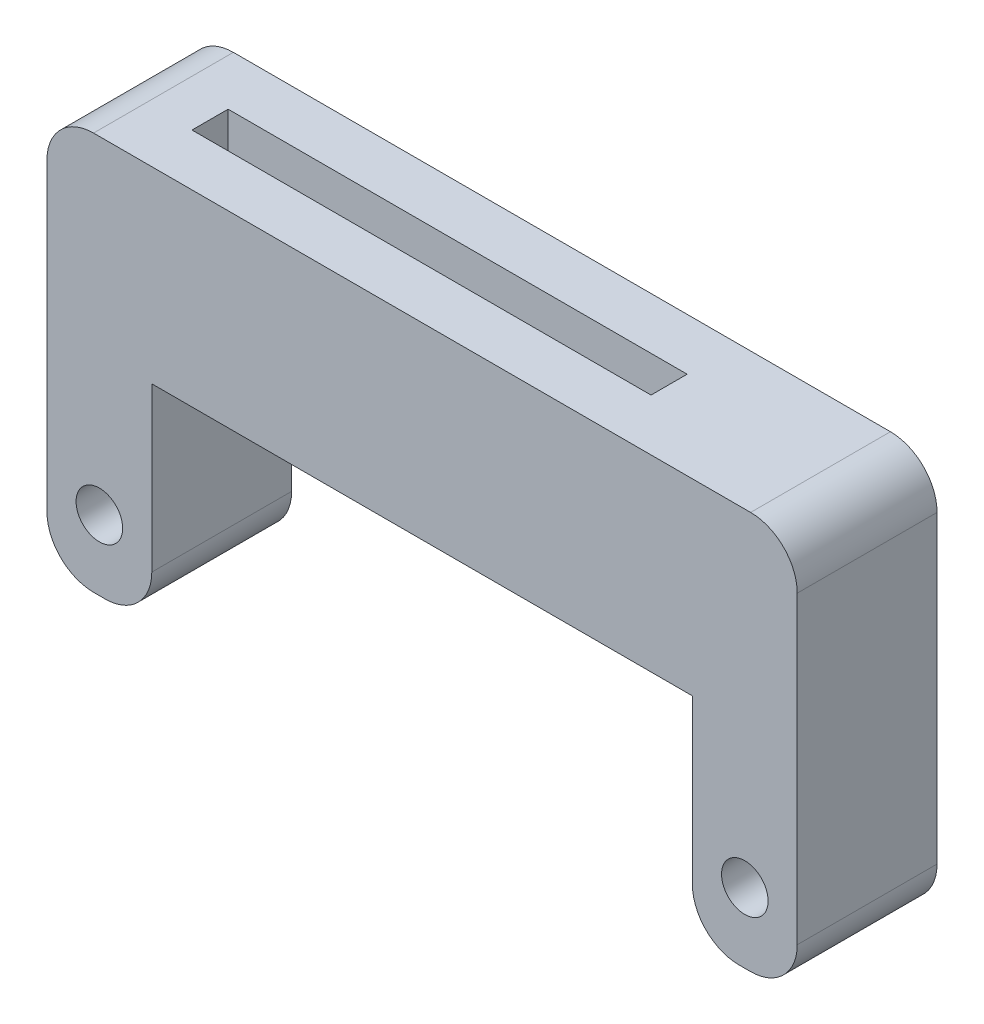
ISO-10303-21;
HEADER;
FILE_DESCRIPTION(('STEP AP214'),'2;1');
FILE_NAME('part.step','',(''),(''),'','','');
FILE_SCHEMA(('AUTOMOTIVE_DESIGN { 1 0 10303 214 1 1 1 1 }'));
ENDSEC;
DATA;
#1=APPLICATION_CONTEXT('core data for automotive mechanical design processes');
#2=APPLICATION_PROTOCOL_DEFINITION('international standard','automotive_design',2000,#1);
#3=PRODUCT_CONTEXT('',#1,'mechanical');
#4=PRODUCT('Part','Part','',(#3));
#5=PRODUCT_RELATED_PRODUCT_CATEGORY('part','',(#4));
#6=PRODUCT_DEFINITION_FORMATION('','',#4);
#7=PRODUCT_DEFINITION_CONTEXT('part definition',#1,'design');
#8=PRODUCT_DEFINITION('design','',#6,#7);
#9=PRODUCT_DEFINITION_SHAPE('','',#8);
#10=(LENGTH_UNIT() NAMED_UNIT(*) SI_UNIT(.MILLI.,.METRE.));
#11=(NAMED_UNIT(*) PLANE_ANGLE_UNIT() SI_UNIT($,.RADIAN.));
#12=(NAMED_UNIT(*) SI_UNIT($,.STERADIAN.) SOLID_ANGLE_UNIT());
#13=UNCERTAINTY_MEASURE_WITH_UNIT(LENGTH_MEASURE(1.E-05),#10,'distance_accuracy_value','');
#14=(GEOMETRIC_REPRESENTATION_CONTEXT(3) GLOBAL_UNCERTAINTY_ASSIGNED_CONTEXT((#13)) GLOBAL_UNIT_ASSIGNED_CONTEXT((#10,
#11,#12)) REPRESENTATION_CONTEXT('',''));
#15=CARTESIAN_POINT('',(0.,0.,0.));
#16=DIRECTION('',(0.,0.,1.));
#17=DIRECTION('',(1.,0.,0.));
#18=AXIS2_PLACEMENT_3D('',#15,#16,#17);
#19=CARTESIAN_POINT('',(-16.1,-8.534,3.));
#20=DIRECTION('',(0.,1.,0.));
#21=DIRECTION('',(0.,0.,1.));
#22=AXIS2_PLACEMENT_3D('',#19,#20,#21);
#23=PLANE('',#22);
#24=DIRECTION('',(1.,0.,0.));
#25=VECTOR('',#24,1.);
#26=CARTESIAN_POINT('',(-16.1,-8.534,3.));
#27=LINE('',#26,#25);
#28=CARTESIAN_POINT('',(-14.1,-8.534,3.));
#29=VERTEX_POINT('',#28);
#30=CARTESIAN_POINT('',(-13.6,-8.534,3.));
#31=VERTEX_POINT('',#30);
#32=EDGE_CURVE('E272',#29,#31,#27,.T.);
#33=ORIENTED_EDGE('',*,*,#32,.F.);
#34=DIRECTION('',(0.,0.,-1.));
#35=VECTOR('',#34,1.);
#36=CARTESIAN_POINT('',(-14.1,-8.534,3.));
#37=LINE('',#36,#35);
#38=CARTESIAN_POINT('',(-14.1,-8.534,-3.));
#39=VERTEX_POINT('',#38);
#40=EDGE_CURVE('E291',#29,#39,#37,.T.);
#41=ORIENTED_EDGE('',*,*,#40,.T.);
#42=DIRECTION('',(1.,0.,0.));
#43=VECTOR('',#42,1.);
#44=CARTESIAN_POINT('',(-16.1,-8.534,-3.));
#45=LINE('',#44,#43);
#46=CARTESIAN_POINT('',(-13.6,-8.534,-3.));
#47=VERTEX_POINT('',#46);
#48=EDGE_CURVE('E261',#39,#47,#45,.T.);
#49=ORIENTED_EDGE('',*,*,#48,.T.);
#50=DIRECTION('',(0.,0.,1.));
#51=VECTOR('',#50,1.);
#52=CARTESIAN_POINT('',(-13.6,-8.534,3.));
#53=LINE('',#52,#51);
#54=EDGE_CURVE('E287',#47,#31,#53,.T.);
#55=ORIENTED_EDGE('',*,*,#54,.T.);
#56=EDGE_LOOP('',(#33,#41,#49,#55));
#57=FACE_BOUND('',#56,.T.);
#58=ADVANCED_FACE('F41',(#57),#23,.F.);
#59=CARTESIAN_POINT('',(16.1,-8.534,3.));
#60=DIRECTION('',(-1.,0.,0.));
#61=DIRECTION('',(0.,0.,1.));
#62=AXIS2_PLACEMENT_3D('',#59,#60,#61);
#63=PLANE('',#62);
#64=DIRECTION('',(0.,1.,0.));
#65=VECTOR('',#64,1.);
#66=CARTESIAN_POINT('',(16.1,-8.534,3.));
#67=LINE('',#66,#65);
#68=CARTESIAN_POINT('',(16.1,-6.534,3.));
#69=VERTEX_POINT('',#68);
#70=CARTESIAN_POINT('',(16.1,6.534,3.));
#71=VERTEX_POINT('',#70);
#72=EDGE_CURVE('E257',#69,#71,#67,.T.);
#73=ORIENTED_EDGE('',*,*,#72,.F.);
#74=DIRECTION('',(0.,0.,-1.));
#75=VECTOR('',#74,1.);
#76=CARTESIAN_POINT('',(16.1,-6.534,3.));
#77=LINE('',#76,#75);
#78=CARTESIAN_POINT('',(16.1,-6.534,-3.));
#79=VERTEX_POINT('',#78);
#80=EDGE_CURVE('E352',#69,#79,#77,.T.);
#81=ORIENTED_EDGE('',*,*,#80,.T.);
#82=DIRECTION('',(0.,1.,0.));
#83=VECTOR('',#82,1.);
#84=CARTESIAN_POINT('',(16.1,-8.534,-3.));
#85=LINE('',#84,#83);
#86=CARTESIAN_POINT('',(16.1,6.534,-3.));
#87=VERTEX_POINT('',#86);
#88=EDGE_CURVE('E247',#79,#87,#85,.T.);
#89=ORIENTED_EDGE('',*,*,#88,.T.);
#90=DIRECTION('',(0.,0.,-1.));
#91=VECTOR('',#90,1.);
#92=CARTESIAN_POINT('',(16.1,6.534,3.));
#93=LINE('',#92,#91);
#94=EDGE_CURVE('E349',#87,#71,#93,.F.);
#95=ORIENTED_EDGE('',*,*,#94,.T.);
#96=EDGE_LOOP('',(#73,#81,#89,#95));
#97=FACE_BOUND('',#96,.T.);
#98=ADVANCED_FACE('F387',(#97),#63,.F.);
#99=CARTESIAN_POINT('',(-16.1,8.534,3.));
#100=DIRECTION('',(0.,-1.,0.));
#101=DIRECTION('',(0.,0.,-1.));
#102=AXIS2_PLACEMENT_3D('',#99,#100,#101);
#103=PLANE('',#102);
#104=DIRECTION('',(1.,0.,0.));
#105=VECTOR('',#104,1.);
#106=CARTESIAN_POINT('',(-12.1,8.534,0.775));
#107=LINE('',#106,#105);
#108=CARTESIAN_POINT('',(-12.1,8.534,0.775));
#109=VERTEX_POINT('',#108);
#110=CARTESIAN_POINT('',(7.6,8.534,0.775));
#111=VERTEX_POINT('',#110);
#112=EDGE_CURVE('E233',#109,#111,#107,.T.);
#113=ORIENTED_EDGE('',*,*,#112,.F.);
#114=DIRECTION('',(0.,0.,1.));
#115=VECTOR('',#114,1.);
#116=CARTESIAN_POINT('',(-12.1,8.534,-0.775));
#117=LINE('',#116,#115);
#118=CARTESIAN_POINT('',(-12.1,8.534,-0.775));
#119=VERTEX_POINT('',#118);
#120=EDGE_CURVE('E181',#119,#109,#117,.T.);
#121=ORIENTED_EDGE('',*,*,#120,.F.);
#122=DIRECTION('',(-1.,0.,0.));
#123=VECTOR('',#122,1.);
#124=CARTESIAN_POINT('',(-12.1,8.534,-0.775));
#125=LINE('',#124,#123);
#126=CARTESIAN_POINT('',(7.6,8.534,-0.775));
#127=VERTEX_POINT('',#126);
#128=EDGE_CURVE('E218',#127,#119,#125,.T.);
#129=ORIENTED_EDGE('',*,*,#128,.F.);
#130=DIRECTION('',(0.,0.,-1.));
#131=VECTOR('',#130,1.);
#132=CARTESIAN_POINT('',(7.6,8.534,-0.775));
#133=LINE('',#132,#131);
#134=EDGE_CURVE('E237',#111,#127,#133,.T.);
#135=ORIENTED_EDGE('',*,*,#134,.F.);
#136=EDGE_LOOP('',(#113,#121,#129,#135));
#137=FACE_BOUND('',#136,.T.);
#138=DIRECTION('',(-1.,0.,0.));
#139=VECTOR('',#138,1.);
#140=CARTESIAN_POINT('',(-16.1,8.534,3.));
#141=LINE('',#140,#139);
#142=CARTESIAN_POINT('',(14.1,8.534,3.));
#143=VERTEX_POINT('',#142);
#144=CARTESIAN_POINT('',(-14.1,8.534,3.));
#145=VERTEX_POINT('',#144);
#146=EDGE_CURVE('E260',#143,#145,#141,.T.);
#147=ORIENTED_EDGE('',*,*,#146,.F.);
#148=DIRECTION('',(0.,0.,-1.));
#149=VECTOR('',#148,1.);
#150=CARTESIAN_POINT('',(14.1,8.534,3.));
#151=LINE('',#150,#149);
#152=CARTESIAN_POINT('',(14.1,8.534,-3.));
#153=VERTEX_POINT('',#152);
#154=EDGE_CURVE('E11',#143,#153,#151,.T.);
#155=ORIENTED_EDGE('',*,*,#154,.T.);
#156=DIRECTION('',(-1.,0.,0.));
#157=VECTOR('',#156,1.);
#158=CARTESIAN_POINT('',(-16.1,8.534,-3.));
#159=LINE('',#158,#157);
#160=CARTESIAN_POINT('',(-14.1,8.534,-3.));
#161=VERTEX_POINT('',#160);
#162=EDGE_CURVE('E276',#153,#161,#159,.T.);
#163=ORIENTED_EDGE('',*,*,#162,.T.);
#164=DIRECTION('',(0.,0.,-1.));
#165=VECTOR('',#164,1.);
#166=CARTESIAN_POINT('',(-14.1,8.534,3.));
#167=LINE('',#166,#165);
#168=EDGE_CURVE('E50',#161,#145,#167,.F.);
#169=ORIENTED_EDGE('',*,*,#168,.T.);
#170=EDGE_LOOP('',(#147,#155,#163,#169));
#171=FACE_BOUND('',#170,.T.);
#172=ADVANCED_FACE('F379',(#137,#171),#103,.F.);
#173=CARTESIAN_POINT('',(-16.1,-8.534,3.));
#174=DIRECTION('',(1.,0.,0.));
#175=DIRECTION('',(0.,0.,-1.));
#176=AXIS2_PLACEMENT_3D('',#173,#174,#175);
#177=PLANE('',#176);
#178=DIRECTION('',(0.,-1.,0.));
#179=VECTOR('',#178,1.);
#180=CARTESIAN_POINT('',(-16.1,-8.534,-3.));
#181=LINE('',#180,#179);
#182=CARTESIAN_POINT('',(-16.1,6.534,-3.));
#183=VERTEX_POINT('',#182);
#184=CARTESIAN_POINT('',(-16.1,-6.534,-3.));
#185=VERTEX_POINT('',#184);
#186=EDGE_CURVE('E279',#183,#185,#181,.T.);
#187=ORIENTED_EDGE('',*,*,#186,.T.);
#188=DIRECTION('',(0.,0.,-1.));
#189=VECTOR('',#188,1.);
#190=CARTESIAN_POINT('',(-16.1,-6.534,3.));
#191=LINE('',#190,#189);
#192=CARTESIAN_POINT('',(-16.1,-6.534,3.));
#193=VERTEX_POINT('',#192);
#194=EDGE_CURVE('E317',#185,#193,#191,.F.);
#195=ORIENTED_EDGE('',*,*,#194,.T.);
#196=DIRECTION('',(0.,-1.,0.));
#197=VECTOR('',#196,1.);
#198=CARTESIAN_POINT('',(-16.1,-8.534,3.));
#199=LINE('',#198,#197);
#200=CARTESIAN_POINT('',(-16.1,6.534,3.));
#201=VERTEX_POINT('',#200);
#202=EDGE_CURVE('E264',#201,#193,#199,.T.);
#203=ORIENTED_EDGE('',*,*,#202,.F.);
#204=DIRECTION('',(0.,0.,-1.));
#205=VECTOR('',#204,1.);
#206=CARTESIAN_POINT('',(-16.1,6.534,3.));
#207=LINE('',#206,#205);
#208=EDGE_CURVE('E313',#201,#183,#207,.T.);
#209=ORIENTED_EDGE('',*,*,#208,.T.);
#210=EDGE_LOOP('',(#187,#195,#203,#209));
#211=FACE_BOUND('',#210,.T.);
#212=ADVANCED_FACE('F373',(#211),#177,.F.);
#213=CARTESIAN_POINT('',(13.6,-8.534,3.));
#214=VERTEX_POINT('',#213);
#215=CARTESIAN_POINT('',(14.1,-8.534,3.));
#216=VERTEX_POINT('',#215);
#217=EDGE_CURVE('E268',#214,#216,#27,.T.);
#218=ORIENTED_EDGE('',*,*,#217,.F.);
#219=DIRECTION('',(0.,0.,1.));
#220=VECTOR('',#219,1.);
#221=CARTESIAN_POINT('',(13.6,-8.534,3.));
#222=LINE('',#221,#220);
#223=CARTESIAN_POINT('',(13.6,-8.534,-3.));
#224=VERTEX_POINT('',#223);
#225=EDGE_CURVE('E346',#214,#224,#222,.F.);
#226=ORIENTED_EDGE('',*,*,#225,.T.);
#227=CARTESIAN_POINT('',(14.1,-8.534,-3.));
#228=VERTEX_POINT('',#227);
#229=EDGE_CURVE('E283',#224,#228,#45,.T.);
#230=ORIENTED_EDGE('',*,*,#229,.T.);
#231=DIRECTION('',(0.,0.,-1.));
#232=VECTOR('',#231,1.);
#233=CARTESIAN_POINT('',(14.1,-8.534,3.));
#234=LINE('',#233,#232);
#235=EDGE_CURVE('E343',#228,#216,#234,.F.);
#236=ORIENTED_EDGE('',*,*,#235,.T.);
#237=EDGE_LOOP('',(#218,#226,#230,#236));
#238=FACE_BOUND('',#237,.T.);
#239=ADVANCED_FACE('F397',(#238),#23,.F.);
#240=CARTESIAN_POINT('',(0.,0.,3.));
#241=DIRECTION('',(0.,0.,-1.));
#242=DIRECTION('',(-1.,0.,0.));
#243=AXIS2_PLACEMENT_3D('',#240,#241,#242);
#244=PLANE('',#243);
#245=CARTESIAN_POINT('',(-13.85,-5.534,3.));
#246=DIRECTION('',(0.,0.,1.));
#247=DIRECTION('',(1.,0.,0.));
#248=AXIS2_PLACEMENT_3D('',#245,#246,#247);
#249=CIRCLE('',#248,1.);
#250=CARTESIAN_POINT('',(-12.85,-5.534,3.));
#251=VERTEX_POINT('',#250);
#252=EDGE_CURVE('E618',#251,#251,#249,.T.);
#253=ORIENTED_EDGE('',*,*,#252,.F.);
#254=EDGE_LOOP('',(#253));
#255=FACE_BOUND('',#254,.T.);
#256=CARTESIAN_POINT('',(13.85,-5.534,3.));
#257=DIRECTION('',(0.,0.,1.));
#258=DIRECTION('',(1.,0.,0.));
#259=AXIS2_PLACEMENT_3D('',#256,#257,#258);
#260=CIRCLE('',#259,1.);
#261=CARTESIAN_POINT('',(14.85,-5.534,3.));
#262=VERTEX_POINT('',#261);
#263=EDGE_CURVE('E626',#262,#262,#260,.T.);
#264=ORIENTED_EDGE('',*,*,#263,.F.);
#265=EDGE_LOOP('',(#264));
#266=FACE_BOUND('',#265,.T.);
#267=ORIENTED_EDGE('',*,*,#202,.T.);
#268=CARTESIAN_POINT('',(-14.1,-6.534,3.));
#269=DIRECTION('',(0.,0.,-1.));
#270=DIRECTION('',(-1.,0.,0.));
#271=AXIS2_PLACEMENT_3D('',#268,#269,#270);
#272=CIRCLE('',#271,2.);
#273=EDGE_CURVE('E334',#193,#29,#272,.F.);
#274=ORIENTED_EDGE('',*,*,#273,.T.);
#275=ORIENTED_EDGE('',*,*,#32,.T.);
#276=CARTESIAN_POINT('',(-13.6,-6.534,3.));
#277=DIRECTION('',(0.,0.,-1.));
#278=DIRECTION('',(-1.,0.,0.));
#279=AXIS2_PLACEMENT_3D('',#276,#277,#278);
#280=CIRCLE('',#279,2.);
#281=CARTESIAN_POINT('',(-11.6,-6.534,3.));
#282=VERTEX_POINT('',#281);
#283=EDGE_CURVE('E331',#31,#282,#280,.F.);
#284=ORIENTED_EDGE('',*,*,#283,.T.);
#285=DIRECTION('',(0.,-1.,0.));
#286=VECTOR('',#285,1.);
#287=CARTESIAN_POINT('',(-11.6,-8.534,3.));
#288=LINE('',#287,#286);
#289=CARTESIAN_POINT('',(-11.6,0.465999999999999,3.));
#290=VERTEX_POINT('',#289);
#291=EDGE_CURVE('E204',#290,#282,#288,.T.);
#292=ORIENTED_EDGE('',*,*,#291,.F.);
#293=DIRECTION('',(-1.,0.,0.));
#294=VECTOR('',#293,1.);
#295=CARTESIAN_POINT('',(-11.6,0.465999999999999,3.));
#296=LINE('',#295,#294);
#297=CARTESIAN_POINT('',(11.6,0.465999999999999,3.));
#298=VERTEX_POINT('',#297);
#299=EDGE_CURVE('E176',#298,#290,#296,.T.);
#300=ORIENTED_EDGE('',*,*,#299,.F.);
#301=DIRECTION('',(0.,1.,0.));
#302=VECTOR('',#301,1.);
#303=CARTESIAN_POINT('',(11.6,-8.534,3.));
#304=LINE('',#303,#302);
#305=CARTESIAN_POINT('',(11.6,-6.534,3.));
#306=VERTEX_POINT('',#305);
#307=EDGE_CURVE('E207',#306,#298,#304,.T.);
#308=ORIENTED_EDGE('',*,*,#307,.F.);
#309=CARTESIAN_POINT('',(13.6,-6.534,3.));
#310=DIRECTION('',(0.,0.,-1.));
#311=DIRECTION('',(-1.,0.,0.));
#312=AXIS2_PLACEMENT_3D('',#309,#310,#311);
#313=CIRCLE('',#312,2.);
#314=EDGE_CURVE('E328',#306,#214,#313,.F.);
#315=ORIENTED_EDGE('',*,*,#314,.T.);
#316=ORIENTED_EDGE('',*,*,#217,.T.);
#317=CARTESIAN_POINT('',(14.1,-6.534,3.));
#318=DIRECTION('',(0.,0.,-1.));
#319=DIRECTION('',(-1.,0.,0.));
#320=AXIS2_PLACEMENT_3D('',#317,#318,#319);
#321=CIRCLE('',#320,2.);
#322=EDGE_CURVE('E325',#216,#69,#321,.F.);
#323=ORIENTED_EDGE('',*,*,#322,.T.);
#324=ORIENTED_EDGE('',*,*,#72,.T.);
#325=CARTESIAN_POINT('',(14.1,6.534,3.));
#326=DIRECTION('',(0.,0.,-1.));
#327=DIRECTION('',(-1.,0.,0.));
#328=AXIS2_PLACEMENT_3D('',#325,#326,#327);
#329=CIRCLE('',#328,2.);
#330=EDGE_CURVE('E63',#71,#143,#329,.F.);
#331=ORIENTED_EDGE('',*,*,#330,.T.);
#332=ORIENTED_EDGE('',*,*,#146,.T.);
#333=CARTESIAN_POINT('',(-14.1,6.534,3.));
#334=DIRECTION('',(0.,0.,-1.));
#335=DIRECTION('',(-1.,0.,0.));
#336=AXIS2_PLACEMENT_3D('',#333,#334,#335);
#337=CIRCLE('',#336,2.);
#338=EDGE_CURVE('E320',#145,#201,#337,.F.);
#339=ORIENTED_EDGE('',*,*,#338,.T.);
#340=EDGE_LOOP('',(#267,#274,#275,#284,#292,#300,#308,#315,#316,#323,#324,#331,#332,#339));
#341=FACE_BOUND('',#340,.T.);
#342=ADVANCED_FACE('F366',(#255,#266,#341),#244,.F.);
#343=CARTESIAN_POINT('',(0.,0.,-3.));
#344=DIRECTION('',(0.,0.,-1.));
#345=DIRECTION('',(-1.,0.,0.));
#346=AXIS2_PLACEMENT_3D('',#343,#344,#345);
#347=PLANE('',#346);
#348=CARTESIAN_POINT('',(-13.85,-5.534,-3.));
#349=DIRECTION('',(0.,0.,1.));
#350=DIRECTION('',(1.,0.,0.));
#351=AXIS2_PLACEMENT_3D('',#348,#349,#350);
#352=CIRCLE('',#351,1.);
#353=CARTESIAN_POINT('',(-12.85,-5.534,-3.));
#354=VERTEX_POINT('',#353);
#355=EDGE_CURVE('E208',#354,#354,#352,.T.);
#356=ORIENTED_EDGE('',*,*,#355,.T.);
#357=EDGE_LOOP('',(#356));
#358=FACE_BOUND('',#357,.T.);
#359=CARTESIAN_POINT('',(13.85,-5.534,-3.));
#360=DIRECTION('',(0.,0.,1.));
#361=DIRECTION('',(1.,0.,0.));
#362=AXIS2_PLACEMENT_3D('',#359,#360,#361);
#363=CIRCLE('',#362,1.);
#364=CARTESIAN_POINT('',(14.85,-5.534,-3.));
#365=VERTEX_POINT('',#364);
#366=EDGE_CURVE('E620',#365,#365,#363,.T.);
#367=ORIENTED_EDGE('',*,*,#366,.T.);
#368=EDGE_LOOP('',(#367));
#369=FACE_BOUND('',#368,.T.);
#370=ORIENTED_EDGE('',*,*,#48,.F.);
#371=CARTESIAN_POINT('',(-14.1,-6.534,-3.));
#372=DIRECTION('',(0.,0.,-1.));
#373=DIRECTION('',(-1.,0.,0.));
#374=AXIS2_PLACEMENT_3D('',#371,#372,#373);
#375=CIRCLE('',#374,2.);
#376=EDGE_CURVE('E310',#39,#185,#375,.T.);
#377=ORIENTED_EDGE('',*,*,#376,.T.);
#378=ORIENTED_EDGE('',*,*,#186,.F.);
#379=CARTESIAN_POINT('',(-14.1,6.534,-3.));
#380=DIRECTION('',(0.,0.,-1.));
#381=DIRECTION('',(-1.,0.,0.));
#382=AXIS2_PLACEMENT_3D('',#379,#380,#381);
#383=CIRCLE('',#382,2.);
#384=EDGE_CURVE('E295',#183,#161,#383,.T.);
#385=ORIENTED_EDGE('',*,*,#384,.T.);
#386=ORIENTED_EDGE('',*,*,#162,.F.);
#387=CARTESIAN_POINT('',(14.1,6.534,-3.));
#388=DIRECTION('',(0.,0.,-1.));
#389=DIRECTION('',(-1.,0.,0.));
#390=AXIS2_PLACEMENT_3D('',#387,#388,#389);
#391=CIRCLE('',#390,2.);
#392=EDGE_CURVE('E298',#153,#87,#391,.T.);
#393=ORIENTED_EDGE('',*,*,#392,.T.);
#394=ORIENTED_EDGE('',*,*,#88,.F.);
#395=CARTESIAN_POINT('',(14.1,-6.534,-3.));
#396=DIRECTION('',(0.,0.,-1.));
#397=DIRECTION('',(-1.,0.,0.));
#398=AXIS2_PLACEMENT_3D('',#395,#396,#397);
#399=CIRCLE('',#398,2.);
#400=EDGE_CURVE('E301',#79,#228,#399,.T.);
#401=ORIENTED_EDGE('',*,*,#400,.T.);
#402=ORIENTED_EDGE('',*,*,#229,.F.);
#403=CARTESIAN_POINT('',(13.6,-6.534,-3.));
#404=DIRECTION('',(0.,0.,-1.));
#405=DIRECTION('',(-1.,0.,0.));
#406=AXIS2_PLACEMENT_3D('',#403,#404,#405);
#407=CIRCLE('',#406,2.);
#408=CARTESIAN_POINT('',(11.6,-6.534,-3.));
#409=VERTEX_POINT('',#408);
#410=EDGE_CURVE('E304',#224,#409,#407,.T.);
#411=ORIENTED_EDGE('',*,*,#410,.T.);
#412=DIRECTION('',(0.,1.,0.));
#413=VECTOR('',#412,1.);
#414=CARTESIAN_POINT('',(11.6,-8.534,-3.));
#415=LINE('',#414,#413);
#416=CARTESIAN_POINT('',(11.6,0.465999999999999,-3.));
#417=VERTEX_POINT('',#416);
#418=EDGE_CURVE('E192',#409,#417,#415,.T.);
#419=ORIENTED_EDGE('',*,*,#418,.T.);
#420=DIRECTION('',(-1.,0.,0.));
#421=VECTOR('',#420,1.);
#422=CARTESIAN_POINT('',(-11.6,0.465999999999999,-3.));
#423=LINE('',#422,#421);
#424=CARTESIAN_POINT('',(-11.6,0.465999999999999,-3.));
#425=VERTEX_POINT('',#424);
#426=EDGE_CURVE('E173',#417,#425,#423,.T.);
#427=ORIENTED_EDGE('',*,*,#426,.T.);
#428=DIRECTION('',(0.,-1.,0.));
#429=VECTOR('',#428,1.);
#430=CARTESIAN_POINT('',(-11.6,-8.534,-3.));
#431=LINE('',#430,#429);
#432=CARTESIAN_POINT('',(-11.6,-6.534,-3.));
#433=VERTEX_POINT('',#432);
#434=EDGE_CURVE('E185',#425,#433,#431,.T.);
#435=ORIENTED_EDGE('',*,*,#434,.T.);
#436=CARTESIAN_POINT('',(-13.6,-6.534,-3.));
#437=DIRECTION('',(0.,0.,-1.));
#438=DIRECTION('',(-1.,0.,0.));
#439=AXIS2_PLACEMENT_3D('',#436,#437,#438);
#440=CIRCLE('',#439,2.);
#441=EDGE_CURVE('E307',#433,#47,#440,.T.);
#442=ORIENTED_EDGE('',*,*,#441,.T.);
#443=EDGE_LOOP('',(#370,#377,#378,#385,#386,#393,#394,#401,#402,#411,#419,#427,#435,#442));
#444=FACE_BOUND('',#443,.T.);
#445=ADVANCED_FACE('F195',(#358,#369,#444),#347,.T.);
#446=CARTESIAN_POINT('',(-12.1,3.534,-0.775));
#447=DIRECTION('',(-1.,0.,0.));
#448=DIRECTION('',(0.,0.,1.));
#449=AXIS2_PLACEMENT_3D('',#446,#447,#448);
#450=PLANE('',#449);
#451=ORIENTED_EDGE('',*,*,#120,.T.);
#452=DIRECTION('',(0.,1.,0.));
#453=VECTOR('',#452,1.);
#454=CARTESIAN_POINT('',(-12.1,3.534,0.775));
#455=LINE('',#454,#453);
#456=CARTESIAN_POINT('',(-12.1,3.534,0.775));
#457=VERTEX_POINT('',#456);
#458=EDGE_CURVE('E230',#457,#109,#455,.T.);
#459=ORIENTED_EDGE('',*,*,#458,.F.);
#460=DIRECTION('',(0.,0.,1.));
#461=VECTOR('',#460,1.);
#462=CARTESIAN_POINT('',(-12.1,3.534,-0.775));
#463=LINE('',#462,#461);
#464=CARTESIAN_POINT('',(-12.1,3.534,-0.775));
#465=VERTEX_POINT('',#464);
#466=EDGE_CURVE('E213',#465,#457,#463,.T.);
#467=ORIENTED_EDGE('',*,*,#466,.F.);
#468=DIRECTION('',(0.,1.,0.));
#469=VECTOR('',#468,1.);
#470=CARTESIAN_POINT('',(-12.1,3.534,-0.775));
#471=LINE('',#470,#469);
#472=EDGE_CURVE('E244',#465,#119,#471,.T.);
#473=ORIENTED_EDGE('',*,*,#472,.T.);
#474=EDGE_LOOP('',(#451,#459,#467,#473));
#475=FACE_BOUND('',#474,.T.);
#476=ADVANCED_FACE('F506',(#475),#450,.F.);
#477=CARTESIAN_POINT('',(-12.1,3.534,-0.775));
#478=DIRECTION('',(0.,0.,-1.));
#479=DIRECTION('',(-1.,0.,0.));
#480=AXIS2_PLACEMENT_3D('',#477,#478,#479);
#481=PLANE('',#480);
#482=ORIENTED_EDGE('',*,*,#128,.T.);
#483=ORIENTED_EDGE('',*,*,#472,.F.);
#484=DIRECTION('',(-1.,0.,0.));
#485=VECTOR('',#484,1.);
#486=CARTESIAN_POINT('',(-12.1,3.534,-0.775));
#487=LINE('',#486,#485);
#488=CARTESIAN_POINT('',(7.6,3.534,-0.775));
#489=VERTEX_POINT('',#488);
#490=EDGE_CURVE('E226',#489,#465,#487,.T.);
#491=ORIENTED_EDGE('',*,*,#490,.F.);
#492=DIRECTION('',(0.,1.,0.));
#493=VECTOR('',#492,1.);
#494=CARTESIAN_POINT('',(7.6,3.534,-0.775));
#495=LINE('',#494,#493);
#496=EDGE_CURVE('E248',#489,#127,#495,.T.);
#497=ORIENTED_EDGE('',*,*,#496,.T.);
#498=EDGE_LOOP('',(#482,#483,#491,#497));
#499=FACE_BOUND('',#498,.T.);
#500=ADVANCED_FACE('F584',(#499),#481,.F.);
#501=CARTESIAN_POINT('',(7.6,3.534,-0.775));
#502=DIRECTION('',(1.,0.,0.));
#503=DIRECTION('',(0.,0.,-1.));
#504=AXIS2_PLACEMENT_3D('',#501,#502,#503);
#505=PLANE('',#504);
#506=ORIENTED_EDGE('',*,*,#134,.T.);
#507=ORIENTED_EDGE('',*,*,#496,.F.);
#508=DIRECTION('',(0.,0.,-1.));
#509=VECTOR('',#508,1.);
#510=CARTESIAN_POINT('',(7.6,3.534,-0.775));
#511=LINE('',#510,#509);
#512=CARTESIAN_POINT('',(7.6,3.534,0.775));
#513=VERTEX_POINT('',#512);
#514=EDGE_CURVE('E222',#513,#489,#511,.T.);
#515=ORIENTED_EDGE('',*,*,#514,.F.);
#516=DIRECTION('',(0.,1.,0.));
#517=VECTOR('',#516,1.);
#518=CARTESIAN_POINT('',(7.6,3.534,0.775));
#519=LINE('',#518,#517);
#520=EDGE_CURVE('E251',#513,#111,#519,.T.);
#521=ORIENTED_EDGE('',*,*,#520,.T.);
#522=EDGE_LOOP('',(#506,#507,#515,#521));
#523=FACE_BOUND('',#522,.T.);
#524=ADVANCED_FACE('F574',(#523),#505,.F.);
#525=CARTESIAN_POINT('',(-12.1,3.534,0.775));
#526=DIRECTION('',(0.,0.,1.));
#527=DIRECTION('',(1.,0.,0.));
#528=AXIS2_PLACEMENT_3D('',#525,#526,#527);
#529=PLANE('',#528);
#530=ORIENTED_EDGE('',*,*,#112,.T.);
#531=ORIENTED_EDGE('',*,*,#520,.F.);
#532=DIRECTION('',(1.,0.,0.));
#533=VECTOR('',#532,1.);
#534=CARTESIAN_POINT('',(-12.1,3.534,0.775));
#535=LINE('',#534,#533);
#536=EDGE_CURVE('E217',#457,#513,#535,.T.);
#537=ORIENTED_EDGE('',*,*,#536,.F.);
#538=ORIENTED_EDGE('',*,*,#458,.T.);
#539=EDGE_LOOP('',(#530,#531,#537,#538));
#540=FACE_BOUND('',#539,.T.);
#541=ADVANCED_FACE('F564',(#540),#529,.F.);
#542=CARTESIAN_POINT('',(0.,3.534,0.));
#543=DIRECTION('',(0.,1.,0.));
#544=DIRECTION('',(0.,0.,1.));
#545=AXIS2_PLACEMENT_3D('',#542,#543,#544);
#546=PLANE('',#545);
#547=ORIENTED_EDGE('',*,*,#466,.T.);
#548=ORIENTED_EDGE('',*,*,#536,.T.);
#549=ORIENTED_EDGE('',*,*,#514,.T.);
#550=ORIENTED_EDGE('',*,*,#490,.T.);
#551=EDGE_LOOP('',(#547,#548,#549,#550));
#552=FACE_BOUND('',#551,.T.);
#553=ADVANCED_FACE('F496',(#552),#546,.T.);
#554=CARTESIAN_POINT('',(-11.6,-8.534,-3.));
#555=DIRECTION('',(-1.,0.,0.));
#556=DIRECTION('',(0.,0.,1.));
#557=AXIS2_PLACEMENT_3D('',#554,#555,#556);
#558=PLANE('',#557);
#559=ORIENTED_EDGE('',*,*,#291,.T.);
#560=DIRECTION('',(0.,0.,1.));
#561=VECTOR('',#560,1.);
#562=CARTESIAN_POINT('',(-11.6,-6.534,-3.));
#563=LINE('',#562,#561);
#564=EDGE_CURVE('E188',#282,#433,#563,.F.);
#565=ORIENTED_EDGE('',*,*,#564,.T.);
#566=ORIENTED_EDGE('',*,*,#434,.F.);
#567=DIRECTION('',(0.,0.,1.));
#568=VECTOR('',#567,1.);
#569=CARTESIAN_POINT('',(-11.6,0.465999999999999,-3.));
#570=LINE('',#569,#568);
#571=EDGE_CURVE('E168',#425,#290,#570,.T.);
#572=ORIENTED_EDGE('',*,*,#571,.T.);
#573=EDGE_LOOP('',(#559,#565,#566,#572));
#574=FACE_BOUND('',#573,.T.);
#575=ADVANCED_FACE('F186',(#574),#558,.F.);
#576=CARTESIAN_POINT('',(-11.6,0.465999999999999,-3.));
#577=DIRECTION('',(0.,1.,0.));
#578=DIRECTION('',(0.,0.,1.));
#579=AXIS2_PLACEMENT_3D('',#576,#577,#578);
#580=PLANE('',#579);
#581=ORIENTED_EDGE('',*,*,#299,.T.);
#582=ORIENTED_EDGE('',*,*,#571,.F.);
#583=ORIENTED_EDGE('',*,*,#426,.F.);
#584=DIRECTION('',(0.,0.,1.));
#585=VECTOR('',#584,1.);
#586=CARTESIAN_POINT('',(11.6,0.465999999999999,-3.));
#587=LINE('',#586,#585);
#588=EDGE_CURVE('E182',#417,#298,#587,.T.);
#589=ORIENTED_EDGE('',*,*,#588,.T.);
#590=EDGE_LOOP('',(#581,#582,#583,#589));
#591=FACE_BOUND('',#590,.T.);
#592=ADVANCED_FACE('F170',(#591),#580,.F.);
#593=CARTESIAN_POINT('',(11.6,-8.534,-3.));
#594=DIRECTION('',(1.,0.,0.));
#595=DIRECTION('',(0.,0.,-1.));
#596=AXIS2_PLACEMENT_3D('',#593,#594,#595);
#597=PLANE('',#596);
#598=ORIENTED_EDGE('',*,*,#418,.F.);
#599=DIRECTION('',(0.,0.,1.));
#600=VECTOR('',#599,1.);
#601=CARTESIAN_POINT('',(11.6,-6.534,-3.));
#602=LINE('',#601,#600);
#603=EDGE_CURVE('E339',#409,#306,#602,.T.);
#604=ORIENTED_EDGE('',*,*,#603,.T.);
#605=ORIENTED_EDGE('',*,*,#307,.T.);
#606=ORIENTED_EDGE('',*,*,#588,.F.);
#607=EDGE_LOOP('',(#598,#604,#605,#606));
#608=FACE_BOUND('',#607,.T.);
#609=ADVANCED_FACE('F403',(#608),#597,.F.);
#610=CARTESIAN_POINT('',(13.85,-5.534,-3.));
#611=DIRECTION('',(0.,0.,1.));
#612=DIRECTION('',(1.,0.,0.));
#613=AXIS2_PLACEMENT_3D('',#610,#611,#612);
#614=CYLINDRICAL_SURFACE('',#613,1.);
#615=ORIENTED_EDGE('',*,*,#366,.F.);
#616=EDGE_LOOP('',(#615));
#617=FACE_BOUND('',#616,.T.);
#618=ORIENTED_EDGE('',*,*,#263,.T.);
#619=EDGE_LOOP('',(#618));
#620=FACE_BOUND('',#619,.T.);
#621=ADVANCED_FACE('F406',(#617,#620),#614,.F.);
#622=CARTESIAN_POINT('',(-13.85,-5.534,-3.));
#623=DIRECTION('',(0.,0.,1.));
#624=DIRECTION('',(1.,0.,0.));
#625=AXIS2_PLACEMENT_3D('',#622,#623,#624);
#626=CYLINDRICAL_SURFACE('',#625,1.);
#627=ORIENTED_EDGE('',*,*,#355,.F.);
#628=EDGE_LOOP('',(#627));
#629=FACE_BOUND('',#628,.T.);
#630=ORIENTED_EDGE('',*,*,#252,.T.);
#631=EDGE_LOOP('',(#630));
#632=FACE_BOUND('',#631,.T.);
#633=ADVANCED_FACE('F412',(#629,#632),#626,.F.);
#634=CARTESIAN_POINT('',(-14.1,-6.534,3.));
#635=DIRECTION('',(0.,0.,-1.));
#636=DIRECTION('',(-1.,0.,0.));
#637=AXIS2_PLACEMENT_3D('',#634,#635,#636);
#638=CYLINDRICAL_SURFACE('',#637,2.);
#639=ORIENTED_EDGE('',*,*,#273,.F.);
#640=ORIENTED_EDGE('',*,*,#194,.F.);
#641=ORIENTED_EDGE('',*,*,#376,.F.);
#642=ORIENTED_EDGE('',*,*,#40,.F.);
#643=EDGE_LOOP('',(#639,#640,#641,#642));
#644=FACE_BOUND('',#643,.T.);
#645=ADVANCED_FACE('F369',(#644),#638,.T.);
#646=CARTESIAN_POINT('',(-13.6,-6.534,3.));
#647=DIRECTION('',(0.,0.,1.));
#648=DIRECTION('',(1.,0.,0.));
#649=AXIS2_PLACEMENT_3D('',#646,#647,#648);
#650=CYLINDRICAL_SURFACE('',#649,2.);
#651=ORIENTED_EDGE('',*,*,#441,.F.);
#652=ORIENTED_EDGE('',*,*,#564,.F.);
#653=ORIENTED_EDGE('',*,*,#283,.F.);
#654=ORIENTED_EDGE('',*,*,#54,.F.);
#655=EDGE_LOOP('',(#651,#652,#653,#654));
#656=FACE_BOUND('',#655,.T.);
#657=ADVANCED_FACE('F365',(#656),#650,.T.);
#658=CARTESIAN_POINT('',(13.6,-6.534,-3.));
#659=DIRECTION('',(0.,0.,1.));
#660=DIRECTION('',(1.,0.,0.));
#661=AXIS2_PLACEMENT_3D('',#658,#659,#660);
#662=CYLINDRICAL_SURFACE('',#661,2.);
#663=ORIENTED_EDGE('',*,*,#410,.F.);
#664=ORIENTED_EDGE('',*,*,#225,.F.);
#665=ORIENTED_EDGE('',*,*,#314,.F.);
#666=ORIENTED_EDGE('',*,*,#603,.F.);
#667=EDGE_LOOP('',(#663,#664,#665,#666));
#668=FACE_BOUND('',#667,.T.);
#669=ADVANCED_FACE('F400',(#668),#662,.T.);
#670=CARTESIAN_POINT('',(14.1,-6.534,3.));
#671=DIRECTION('',(0.,0.,-1.));
#672=DIRECTION('',(-1.,0.,0.));
#673=AXIS2_PLACEMENT_3D('',#670,#671,#672);
#674=CYLINDRICAL_SURFACE('',#673,2.);
#675=ORIENTED_EDGE('',*,*,#322,.F.);
#676=ORIENTED_EDGE('',*,*,#235,.F.);
#677=ORIENTED_EDGE('',*,*,#400,.F.);
#678=ORIENTED_EDGE('',*,*,#80,.F.);
#679=EDGE_LOOP('',(#675,#676,#677,#678));
#680=FACE_BOUND('',#679,.T.);
#681=ADVANCED_FACE('F391',(#680),#674,.T.);
#682=CARTESIAN_POINT('',(14.1,6.534,3.));
#683=DIRECTION('',(0.,0.,-1.));
#684=DIRECTION('',(-1.,0.,0.));
#685=AXIS2_PLACEMENT_3D('',#682,#683,#684);
#686=CYLINDRICAL_SURFACE('',#685,2.);
#687=ORIENTED_EDGE('',*,*,#330,.F.);
#688=ORIENTED_EDGE('',*,*,#94,.F.);
#689=ORIENTED_EDGE('',*,*,#392,.F.);
#690=ORIENTED_EDGE('',*,*,#154,.F.);
#691=EDGE_LOOP('',(#687,#688,#689,#690));
#692=FACE_BOUND('',#691,.T.);
#693=ADVANCED_FACE('F382',(#692),#686,.T.);
#694=CARTESIAN_POINT('',(-14.1,6.534,3.));
#695=DIRECTION('',(0.,0.,-1.));
#696=DIRECTION('',(-1.,0.,0.));
#697=AXIS2_PLACEMENT_3D('',#694,#695,#696);
#698=CYLINDRICAL_SURFACE('',#697,2.);
#699=ORIENTED_EDGE('',*,*,#338,.F.);
#700=ORIENTED_EDGE('',*,*,#168,.F.);
#701=ORIENTED_EDGE('',*,*,#384,.F.);
#702=ORIENTED_EDGE('',*,*,#208,.F.);
#703=EDGE_LOOP('',(#699,#700,#701,#702));
#704=FACE_BOUND('',#703,.T.);
#705=ADVANCED_FACE('F43',(#704),#698,.T.);
#706=CLOSED_SHELL('',(#58,#98,#172,#212,#239,#342,#445,#476,#500,#524,#541,#553,#575,#592,#609,
#621,#633,#645,#657,#669,#681,#693,#705));
#707=MANIFOLD_SOLID_BREP('B2',#706);
#708=ADVANCED_BREP_SHAPE_REPRESENTATION('',(#18,#707),#14);
#709=SHAPE_DEFINITION_REPRESENTATION(#9,#708);
ENDSEC;
END-ISO-10303-21;
